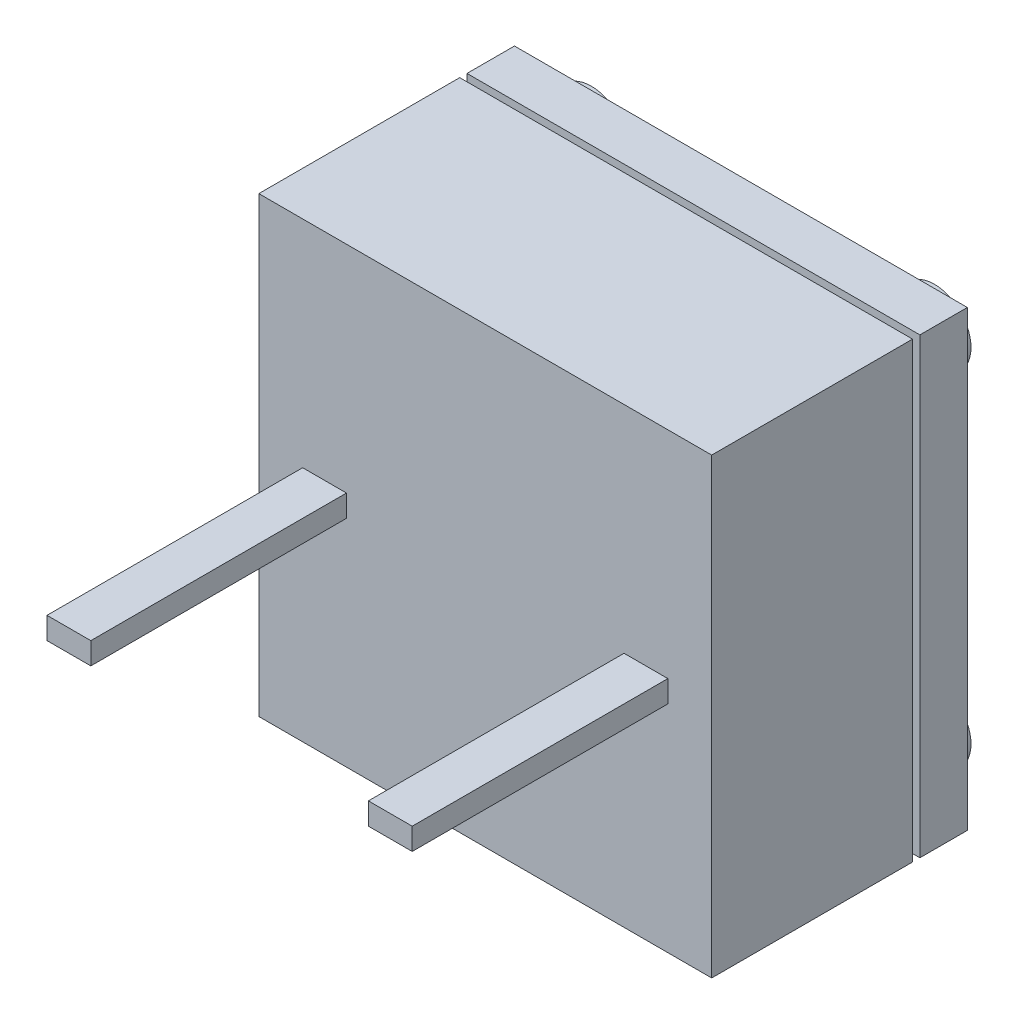
ISO-10303-21;
HEADER;
FILE_DESCRIPTION(('STEP AP214'),'2;1');
FILE_NAME('part.step','',(''),(''),'','','');
FILE_SCHEMA(('AUTOMOTIVE_DESIGN { 1 0 10303 214 1 1 1 1 }'));
ENDSEC;
DATA;
#1=APPLICATION_CONTEXT('core data for automotive mechanical design processes');
#2=APPLICATION_PROTOCOL_DEFINITION('international standard','automotive_design',2000,#1);
#3=PRODUCT_CONTEXT('',#1,'mechanical');
#4=PRODUCT('Part','Part','',(#3));
#5=PRODUCT_RELATED_PRODUCT_CATEGORY('part','',(#4));
#6=PRODUCT_DEFINITION_FORMATION('','',#4);
#7=PRODUCT_DEFINITION_CONTEXT('part definition',#1,'design');
#8=PRODUCT_DEFINITION('design','',#6,#7);
#9=PRODUCT_DEFINITION_SHAPE('','',#8);
#10=(LENGTH_UNIT() NAMED_UNIT(*) SI_UNIT(.MILLI.,.METRE.));
#11=(NAMED_UNIT(*) PLANE_ANGLE_UNIT() SI_UNIT($,.RADIAN.));
#12=(NAMED_UNIT(*) SI_UNIT($,.STERADIAN.) SOLID_ANGLE_UNIT());
#13=UNCERTAINTY_MEASURE_WITH_UNIT(LENGTH_MEASURE(1.E-05),#10,'distance_accuracy_value','');
#14=(GEOMETRIC_REPRESENTATION_CONTEXT(3) GLOBAL_UNCERTAINTY_ASSIGNED_CONTEXT((#13)) GLOBAL_UNIT_ASSIGNED_CONTEXT((#10,
#11,#12)) REPRESENTATION_CONTEXT('',''));
#15=CARTESIAN_POINT('',(0.,0.,0.));
#16=DIRECTION('',(0.,0.,1.));
#17=DIRECTION('',(1.,0.,0.));
#18=AXIS2_PLACEMENT_3D('',#15,#16,#17);
#19=CARTESIAN_POINT('',(0.,0.,3.5));
#20=DIRECTION('',(0.,0.,1.));
#21=DIRECTION('',(1.,0.,0.));
#22=AXIS2_PLACEMENT_3D('',#19,#20,#21);
#23=PLANE('',#22);
#24=DIRECTION('',(1.,0.,0.));
#25=VECTOR('',#24,1.);
#26=CARTESIAN_POINT('',(0.,0.,3.5));
#27=LINE('',#26,#25);
#28=CARTESIAN_POINT('',(0.,0.,3.5));
#29=VERTEX_POINT('',#28);
#30=CARTESIAN_POINT('',(6.2,0.,3.5));
#31=VERTEX_POINT('',#30);
#32=EDGE_CURVE('E290',#29,#31,#27,.T.);
#33=ORIENTED_EDGE('',*,*,#32,.T.);
#34=DIRECTION('',(0.,1.,0.));
#35=VECTOR('',#34,1.);
#36=CARTESIAN_POINT('',(6.2,0.,3.5));
#37=LINE('',#36,#35);
#38=CARTESIAN_POINT('',(6.2,6.2,3.5));
#39=VERTEX_POINT('',#38);
#40=EDGE_CURVE('E293',#31,#39,#37,.T.);
#41=ORIENTED_EDGE('',*,*,#40,.T.);
#42=DIRECTION('',(-1.,0.,0.));
#43=VECTOR('',#42,1.);
#44=CARTESIAN_POINT('',(0.,6.2,3.5));
#45=LINE('',#44,#43);
#46=CARTESIAN_POINT('',(0.,6.2,3.5));
#47=VERTEX_POINT('',#46);
#48=EDGE_CURVE('E296',#39,#47,#45,.T.);
#49=ORIENTED_EDGE('',*,*,#48,.T.);
#50=DIRECTION('',(0.,-1.,0.));
#51=VECTOR('',#50,1.);
#52=CARTESIAN_POINT('',(0.,0.,3.5));
#53=LINE('',#52,#51);
#54=EDGE_CURVE('E298',#47,#29,#53,.T.);
#55=ORIENTED_EDGE('',*,*,#54,.T.);
#56=EDGE_LOOP('',(#33,#41,#49,#55));
#57=FACE_BOUND('',#56,.T.);
#58=DIRECTION('',(-1.,0.,0.));
#59=VECTOR('',#58,1.);
#60=CARTESIAN_POINT('',(0.6,3.25,3.5));
#61=LINE('',#60,#59);
#62=CARTESIAN_POINT('',(1.2,3.25,3.5));
#63=VERTEX_POINT('',#62);
#64=CARTESIAN_POINT('',(0.6,3.25,3.5));
#65=VERTEX_POINT('',#64);
#66=EDGE_CURVE('E201',#63,#65,#61,.T.);
#67=ORIENTED_EDGE('',*,*,#66,.F.);
#68=DIRECTION('',(0.,1.,0.));
#69=VECTOR('',#68,1.);
#70=CARTESIAN_POINT('',(1.2,3.25,3.5));
#71=LINE('',#70,#69);
#72=CARTESIAN_POINT('',(1.2,2.95,3.5));
#73=VERTEX_POINT('',#72);
#74=EDGE_CURVE('E198',#73,#63,#71,.T.);
#75=ORIENTED_EDGE('',*,*,#74,.F.);
#76=DIRECTION('',(1.,0.,0.));
#77=VECTOR('',#76,1.);
#78=CARTESIAN_POINT('',(0.6,2.95,3.5));
#79=LINE('',#78,#77);
#80=CARTESIAN_POINT('',(0.6,2.95,3.5));
#81=VERTEX_POINT('',#80);
#82=EDGE_CURVE('E210',#81,#73,#79,.T.);
#83=ORIENTED_EDGE('',*,*,#82,.F.);
#84=DIRECTION('',(0.,-1.,0.));
#85=VECTOR('',#84,1.);
#86=CARTESIAN_POINT('',(0.6,2.95,3.5));
#87=LINE('',#86,#85);
#88=EDGE_CURVE('E218',#65,#81,#87,.T.);
#89=ORIENTED_EDGE('',*,*,#88,.F.);
#90=EDGE_LOOP('',(#67,#75,#83,#89));
#91=FACE_BOUND('',#90,.T.);
#92=DIRECTION('',(1.,0.,0.));
#93=VECTOR('',#92,1.);
#94=CARTESIAN_POINT('',(5.,2.95,3.5));
#95=LINE('',#94,#93);
#96=CARTESIAN_POINT('',(5.,2.95,3.5));
#97=VERTEX_POINT('',#96);
#98=CARTESIAN_POINT('',(5.6,2.95,3.5));
#99=VERTEX_POINT('',#98);
#100=EDGE_CURVE('E768',#97,#99,#95,.T.);
#101=ORIENTED_EDGE('',*,*,#100,.F.);
#102=DIRECTION('',(0.,-1.,0.));
#103=VECTOR('',#102,1.);
#104=CARTESIAN_POINT('',(5.,3.25,3.5));
#105=LINE('',#104,#103);
#106=CARTESIAN_POINT('',(5.,3.25,3.5));
#107=VERTEX_POINT('',#106);
#108=EDGE_CURVE('E196',#107,#97,#105,.T.);
#109=ORIENTED_EDGE('',*,*,#108,.F.);
#110=DIRECTION('',(-1.,0.,0.));
#111=VECTOR('',#110,1.);
#112=CARTESIAN_POINT('',(5.6,3.25,3.5));
#113=LINE('',#112,#111);
#114=CARTESIAN_POINT('',(5.6,3.25,3.5));
#115=VERTEX_POINT('',#114);
#116=EDGE_CURVE('E192',#115,#107,#113,.T.);
#117=ORIENTED_EDGE('',*,*,#116,.F.);
#118=DIRECTION('',(0.,1.,0.));
#119=VECTOR('',#118,1.);
#120=CARTESIAN_POINT('',(5.6,3.1,3.5));
#121=LINE('',#120,#119);
#122=EDGE_CURVE('E765',#99,#115,#121,.T.);
#123=ORIENTED_EDGE('',*,*,#122,.F.);
#124=EDGE_LOOP('',(#101,#109,#117,#123));
#125=FACE_BOUND('',#124,.T.);
#126=ADVANCED_FACE('F35',(#57,#91,#125),#23,.T.);
#127=CARTESIAN_POINT('',(0.,0.,3.5));
#128=DIRECTION('',(0.,1.,0.));
#129=DIRECTION('',(0.,0.,1.));
#130=AXIS2_PLACEMENT_3D('',#127,#128,#129);
#131=PLANE('',#130);
#132=DIRECTION('',(-1.,0.,0.));
#133=VECTOR('',#132,1.);
#134=CARTESIAN_POINT('',(6.2,0.,0.650000000000001));
#135=LINE('',#134,#133);
#136=CARTESIAN_POINT('',(6.2,0.,0.650000000000001));
#137=VERTEX_POINT('',#136);
#138=CARTESIAN_POINT('',(0.,0.,0.650000000000001));
#139=VERTEX_POINT('',#138);
#140=EDGE_CURVE('E260',#137,#139,#135,.T.);
#141=ORIENTED_EDGE('',*,*,#140,.T.);
#142=DIRECTION('',(0.,0.,-1.));
#143=VECTOR('',#142,1.);
#144=CARTESIAN_POINT('',(0.,0.,3.5));
#145=LINE('',#144,#143);
#146=CARTESIAN_POINT('',(0.,0.,0.));
#147=VERTEX_POINT('',#146);
#148=EDGE_CURVE('E300',#139,#147,#145,.T.);
#149=ORIENTED_EDGE('',*,*,#148,.T.);
#150=DIRECTION('',(1.,0.,0.));
#151=VECTOR('',#150,1.);
#152=CARTESIAN_POINT('',(0.,0.,0.));
#153=LINE('',#152,#151);
#154=CARTESIAN_POINT('',(6.2,0.,0.));
#155=VERTEX_POINT('',#154);
#156=EDGE_CURVE('E284',#147,#155,#153,.T.);
#157=ORIENTED_EDGE('',*,*,#156,.T.);
#158=DIRECTION('',(0.,0.,-1.));
#159=VECTOR('',#158,1.);
#160=CARTESIAN_POINT('',(6.2,0.,3.5));
#161=LINE('',#160,#159);
#162=EDGE_CURVE('E322',#137,#155,#161,.T.);
#163=ORIENTED_EDGE('',*,*,#162,.F.);
#164=EDGE_LOOP('',(#141,#149,#157,#163));
#165=FACE_BOUND('',#164,.T.);
#166=ADVANCED_FACE('F362',(#165),#131,.F.);
#167=CARTESIAN_POINT('',(0.,0.,0.750000000000001));
#168=VERTEX_POINT('',#167);
#169=EDGE_CURVE('E311',#29,#168,#145,.T.);
#170=ORIENTED_EDGE('',*,*,#169,.T.);
#171=DIRECTION('',(1.,0.,0.));
#172=VECTOR('',#171,1.);
#173=CARTESIAN_POINT('',(6.1,0.,0.750000000000001));
#174=LINE('',#173,#172);
#175=CARTESIAN_POINT('',(6.2,0.,0.750000000000001));
#176=VERTEX_POINT('',#175);
#177=EDGE_CURVE('E257',#168,#176,#174,.T.);
#178=ORIENTED_EDGE('',*,*,#177,.T.);
#179=EDGE_CURVE('E323',#31,#176,#161,.T.);
#180=ORIENTED_EDGE('',*,*,#179,.F.);
#181=ORIENTED_EDGE('',*,*,#32,.F.);
#182=EDGE_LOOP('',(#170,#178,#180,#181));
#183=FACE_BOUND('',#182,.T.);
#184=ADVANCED_FACE('F37',(#183),#131,.F.);
#185=CARTESIAN_POINT('',(6.2,0.,3.5));
#186=DIRECTION('',(-1.,0.,0.));
#187=DIRECTION('',(0.,0.,1.));
#188=AXIS2_PLACEMENT_3D('',#185,#186,#187);
#189=PLANE('',#188);
#190=ORIENTED_EDGE('',*,*,#179,.T.);
#191=DIRECTION('',(0.,1.,0.));
#192=VECTOR('',#191,1.);
#193=CARTESIAN_POINT('',(6.2,6.1,0.750000000000001));
#194=LINE('',#193,#192);
#195=CARTESIAN_POINT('',(6.2,6.2,0.750000000000001));
#196=VERTEX_POINT('',#195);
#197=EDGE_CURVE('E287',#176,#196,#194,.T.);
#198=ORIENTED_EDGE('',*,*,#197,.T.);
#199=DIRECTION('',(0.,0.,-1.));
#200=VECTOR('',#199,1.);
#201=CARTESIAN_POINT('',(6.2,6.2,3.5));
#202=LINE('',#201,#200);
#203=EDGE_CURVE('E319',#39,#196,#202,.T.);
#204=ORIENTED_EDGE('',*,*,#203,.F.);
#205=ORIENTED_EDGE('',*,*,#40,.F.);
#206=EDGE_LOOP('',(#190,#198,#204,#205));
#207=FACE_BOUND('',#206,.T.);
#208=ADVANCED_FACE('F402',(#207),#189,.F.);
#209=CARTESIAN_POINT('',(0.,0.,3.5));
#210=DIRECTION('',(1.,0.,0.));
#211=DIRECTION('',(0.,0.,-1.));
#212=AXIS2_PLACEMENT_3D('',#209,#210,#211);
#213=PLANE('',#212);
#214=ORIENTED_EDGE('',*,*,#148,.F.);
#215=DIRECTION('',(0.,1.,0.));
#216=VECTOR('',#215,1.);
#217=CARTESIAN_POINT('',(0.,6.1,0.650000000000001));
#218=LINE('',#217,#216);
#219=CARTESIAN_POINT('',(0.,6.2,0.650000000000001));
#220=VERTEX_POINT('',#219);
#221=EDGE_CURVE('E282',#139,#220,#218,.T.);
#222=ORIENTED_EDGE('',*,*,#221,.T.);
#223=DIRECTION('',(0.,0.,-1.));
#224=VECTOR('',#223,1.);
#225=CARTESIAN_POINT('',(0.,6.2,3.5));
#226=LINE('',#225,#224);
#227=CARTESIAN_POINT('',(0.,6.2,0.));
#228=VERTEX_POINT('',#227);
#229=EDGE_CURVE('E314',#220,#228,#226,.T.);
#230=ORIENTED_EDGE('',*,*,#229,.T.);
#231=DIRECTION('',(0.,-1.,0.));
#232=VECTOR('',#231,1.);
#233=CARTESIAN_POINT('',(0.,0.,0.));
#234=LINE('',#233,#232);
#235=EDGE_CURVE('E294',#228,#147,#234,.T.);
#236=ORIENTED_EDGE('',*,*,#235,.T.);
#237=EDGE_LOOP('',(#214,#222,#230,#236));
#238=FACE_BOUND('',#237,.T.);
#239=ADVANCED_FACE('F367',(#238),#213,.F.);
#240=CARTESIAN_POINT('',(0.,6.1,0.));
#241=DIRECTION('',(0.,1.,0.));
#242=DIRECTION('',(0.,0.,1.));
#243=AXIS2_PLACEMENT_3D('',#240,#241,#242);
#244=PLANE('',#243);
#245=DIRECTION('',(0.,0.,1.));
#246=VECTOR('',#245,1.);
#247=CARTESIAN_POINT('',(6.1,6.1,0.));
#248=LINE('',#247,#246);
#249=CARTESIAN_POINT('',(6.1,6.1,0.650000000000001));
#250=VERTEX_POINT('',#249);
#251=CARTESIAN_POINT('',(6.1,6.1,0.750000000000001));
#252=VERTEX_POINT('',#251);
#253=EDGE_CURVE('E329',#250,#252,#248,.T.);
#254=ORIENTED_EDGE('',*,*,#253,.F.);
#255=DIRECTION('',(-1.,0.,0.));
#256=VECTOR('',#255,1.);
#257=CARTESIAN_POINT('',(0.,6.1,0.650000000000001));
#258=LINE('',#257,#256);
#259=CARTESIAN_POINT('',(0.1,6.1,0.650000000000001));
#260=VERTEX_POINT('',#259);
#261=EDGE_CURVE('E273',#250,#260,#258,.T.);
#262=ORIENTED_EDGE('',*,*,#261,.T.);
#263=DIRECTION('',(0.,0.,1.));
#264=VECTOR('',#263,1.);
#265=CARTESIAN_POINT('',(0.100000000000001,6.1,0.));
#266=LINE('',#265,#264);
#267=CARTESIAN_POINT('',(0.1,6.1,0.750000000000001));
#268=VERTEX_POINT('',#267);
#269=EDGE_CURVE('E326',#260,#268,#266,.T.);
#270=ORIENTED_EDGE('',*,*,#269,.T.);
#271=DIRECTION('',(1.,0.,0.));
#272=VECTOR('',#271,1.);
#273=CARTESIAN_POINT('',(0.,6.1,0.750000000000001));
#274=LINE('',#273,#272);
#275=EDGE_CURVE('E270',#268,#252,#274,.T.);
#276=ORIENTED_EDGE('',*,*,#275,.T.);
#277=EDGE_LOOP('',(#254,#262,#270,#276));
#278=FACE_BOUND('',#277,.T.);
#279=ADVANCED_FACE('F406',(#278),#244,.T.);
#280=CARTESIAN_POINT('',(0.,6.2,3.5));
#281=DIRECTION('',(0.,-1.,0.));
#282=DIRECTION('',(0.,0.,-1.));
#283=AXIS2_PLACEMENT_3D('',#280,#281,#282);
#284=PLANE('',#283);
#285=ORIENTED_EDGE('',*,*,#229,.F.);
#286=DIRECTION('',(-1.,0.,0.));
#287=VECTOR('',#286,1.);
#288=CARTESIAN_POINT('',(0.,6.2,0.650000000000001));
#289=LINE('',#288,#287);
#290=CARTESIAN_POINT('',(6.2,6.2,0.650000000000001));
#291=VERTEX_POINT('',#290);
#292=EDGE_CURVE('E274',#291,#220,#289,.T.);
#293=ORIENTED_EDGE('',*,*,#292,.F.);
#294=CARTESIAN_POINT('',(6.2,6.2,0.));
#295=VERTEX_POINT('',#294);
#296=EDGE_CURVE('E318',#291,#295,#202,.T.);
#297=ORIENTED_EDGE('',*,*,#296,.T.);
#298=DIRECTION('',(-1.,0.,0.));
#299=VECTOR('',#298,1.);
#300=CARTESIAN_POINT('',(0.,6.2,0.));
#301=LINE('',#300,#299);
#302=EDGE_CURVE('E306',#295,#228,#301,.T.);
#303=ORIENTED_EDGE('',*,*,#302,.T.);
#304=EDGE_LOOP('',(#285,#293,#297,#303));
#305=FACE_BOUND('',#304,.T.);
#306=ADVANCED_FACE('F371',(#305),#284,.F.);
#307=DIRECTION('',(0.,1.,0.));
#308=VECTOR('',#307,1.);
#309=CARTESIAN_POINT('',(6.2,6.1,0.650000000000001));
#310=LINE('',#309,#308);
#311=EDGE_CURVE('E285',#137,#291,#310,.T.);
#312=ORIENTED_EDGE('',*,*,#311,.F.);
#313=ORIENTED_EDGE('',*,*,#162,.T.);
#314=DIRECTION('',(0.,1.,0.));
#315=VECTOR('',#314,1.);
#316=CARTESIAN_POINT('',(6.2,0.,0.));
#317=LINE('',#316,#315);
#318=EDGE_CURVE('E303',#155,#295,#317,.T.);
#319=ORIENTED_EDGE('',*,*,#318,.T.);
#320=ORIENTED_EDGE('',*,*,#296,.F.);
#321=EDGE_LOOP('',(#312,#313,#319,#320));
#322=FACE_BOUND('',#321,.T.);
#323=ADVANCED_FACE('F374',(#322),#189,.F.);
#324=ORIENTED_EDGE('',*,*,#203,.T.);
#325=DIRECTION('',(1.,0.,0.));
#326=VECTOR('',#325,1.);
#327=CARTESIAN_POINT('',(0.,6.2,0.750000000000001));
#328=LINE('',#327,#326);
#329=CARTESIAN_POINT('',(0.,6.2,0.750000000000001));
#330=VERTEX_POINT('',#329);
#331=EDGE_CURVE('E266',#330,#196,#328,.T.);
#332=ORIENTED_EDGE('',*,*,#331,.F.);
#333=EDGE_CURVE('E315',#47,#330,#226,.T.);
#334=ORIENTED_EDGE('',*,*,#333,.F.);
#335=ORIENTED_EDGE('',*,*,#48,.F.);
#336=EDGE_LOOP('',(#324,#332,#334,#335));
#337=FACE_BOUND('',#336,.T.);
#338=ADVANCED_FACE('F397',(#337),#284,.F.);
#339=DIRECTION('',(0.,1.,0.));
#340=VECTOR('',#339,1.);
#341=CARTESIAN_POINT('',(0.,6.1,0.750000000000001));
#342=LINE('',#341,#340);
#343=EDGE_CURVE('E277',#168,#330,#342,.T.);
#344=ORIENTED_EDGE('',*,*,#343,.F.);
#345=ORIENTED_EDGE('',*,*,#169,.F.);
#346=ORIENTED_EDGE('',*,*,#54,.F.);
#347=ORIENTED_EDGE('',*,*,#333,.T.);
#348=EDGE_LOOP('',(#344,#345,#346,#347));
#349=FACE_BOUND('',#348,.T.);
#350=ADVANCED_FACE('F347',(#349),#213,.F.);
#351=CARTESIAN_POINT('',(0.,0.,0.));
#352=DIRECTION('',(0.,0.,1.));
#353=DIRECTION('',(1.,0.,0.));
#354=AXIS2_PLACEMENT_3D('',#351,#352,#353);
#355=PLANE('',#354);
#356=CARTESIAN_POINT('',(5.45,5.45,0.));
#357=DIRECTION('',(0.,0.,1.));
#358=DIRECTION('',(1.,0.,0.));
#359=AXIS2_PLACEMENT_3D('',#356,#357,#358);
#360=CIRCLE('',#359,0.5);
#361=CARTESIAN_POINT('',(5.95,5.45,0.));
#362=VERTEX_POINT('',#361);
#363=EDGE_CURVE('E11',#362,#362,#360,.F.);
#364=ORIENTED_EDGE('',*,*,#363,.F.);
#365=EDGE_LOOP('',(#364));
#366=FACE_BOUND('',#365,.T.);
#367=CARTESIAN_POINT('',(0.75,5.45,0.));
#368=DIRECTION('',(0.,0.,1.));
#369=DIRECTION('',(1.,0.,0.));
#370=AXIS2_PLACEMENT_3D('',#367,#368,#369);
#371=CIRCLE('',#370,0.5);
#372=CARTESIAN_POINT('',(1.25,5.45,0.));
#373=VERTEX_POINT('',#372);
#374=EDGE_CURVE('E43',#373,#373,#371,.F.);
#375=ORIENTED_EDGE('',*,*,#374,.F.);
#376=EDGE_LOOP('',(#375));
#377=FACE_BOUND('',#376,.T.);
#378=CARTESIAN_POINT('',(5.45,0.749999999999999,0.));
#379=DIRECTION('',(0.,0.,1.));
#380=DIRECTION('',(1.,0.,0.));
#381=AXIS2_PLACEMENT_3D('',#378,#379,#380);
#382=CIRCLE('',#381,0.5);
#383=CARTESIAN_POINT('',(5.95,0.749999999999999,0.));
#384=VERTEX_POINT('',#383);
#385=EDGE_CURVE('E336',#384,#384,#382,.F.);
#386=ORIENTED_EDGE('',*,*,#385,.F.);
#387=EDGE_LOOP('',(#386));
#388=FACE_BOUND('',#387,.T.);
#389=CARTESIAN_POINT('',(0.75,0.749999999999999,0.));
#390=DIRECTION('',(0.,0.,1.));
#391=DIRECTION('',(1.,0.,0.));
#392=AXIS2_PLACEMENT_3D('',#389,#390,#391);
#393=CIRCLE('',#392,0.5);
#394=CARTESIAN_POINT('',(1.25,0.749999999999999,0.));
#395=VERTEX_POINT('',#394);
#396=EDGE_CURVE('E248',#395,#395,#393,.F.);
#397=ORIENTED_EDGE('',*,*,#396,.F.);
#398=EDGE_LOOP('',(#397));
#399=FACE_BOUND('',#398,.T.);
#400=CARTESIAN_POINT('',(3.1,3.1,0.));
#401=DIRECTION('',(0.,0.,-1.));
#402=DIRECTION('',(-1.,0.,0.));
#403=AXIS2_PLACEMENT_3D('',#400,#401,#402);
#404=CIRCLE('',#403,1.75);
#405=CARTESIAN_POINT('',(1.35,3.1,0.));
#406=VERTEX_POINT('',#405);
#407=EDGE_CURVE('E245',#406,#406,#404,.T.);
#408=ORIENTED_EDGE('',*,*,#407,.F.);
#409=EDGE_LOOP('',(#408));
#410=FACE_BOUND('',#409,.T.);
#411=ORIENTED_EDGE('',*,*,#156,.F.);
#412=ORIENTED_EDGE('',*,*,#235,.F.);
#413=ORIENTED_EDGE('',*,*,#302,.F.);
#414=ORIENTED_EDGE('',*,*,#318,.F.);
#415=EDGE_LOOP('',(#411,#412,#413,#414));
#416=FACE_BOUND('',#415,.T.);
#417=ADVANCED_FACE('F343',(#366,#377,#388,#399,#410,#416),#355,.F.);
#418=CARTESIAN_POINT('',(0.,6.1,0.650000000000001));
#419=DIRECTION('',(0.,0.,-1.));
#420=DIRECTION('',(-1.,0.,0.));
#421=AXIS2_PLACEMENT_3D('',#418,#419,#420);
#422=PLANE('',#421);
#423=DIRECTION('',(-1.,0.,0.));
#424=VECTOR('',#423,1.);
#425=CARTESIAN_POINT('',(6.2,0.1,0.650000000000008));
#426=LINE('',#425,#424);
#427=CARTESIAN_POINT('',(6.1,0.1,0.650000000000008));
#428=VERTEX_POINT('',#427);
#429=CARTESIAN_POINT('',(0.100000000000002,0.1,0.650000000000001));
#430=VERTEX_POINT('',#429);
#431=EDGE_CURVE('E250',#428,#430,#426,.T.);
#432=ORIENTED_EDGE('',*,*,#431,.T.);
#433=DIRECTION('',(0.,1.,0.));
#434=VECTOR('',#433,1.);
#435=CARTESIAN_POINT('',(0.1,0.,0.650000000000001));
#436=LINE('',#435,#434);
#437=EDGE_CURVE('E256',#430,#260,#436,.T.);
#438=ORIENTED_EDGE('',*,*,#437,.T.);
#439=ORIENTED_EDGE('',*,*,#261,.F.);
#440=DIRECTION('',(0.,1.,0.));
#441=VECTOR('',#440,1.);
#442=CARTESIAN_POINT('',(6.1,0.,0.650000000000001));
#443=LINE('',#442,#441);
#444=EDGE_CURVE('E263',#428,#250,#443,.T.);
#445=ORIENTED_EDGE('',*,*,#444,.F.);
#446=EDGE_LOOP('',(#432,#438,#439,#445));
#447=FACE_BOUND('',#446,.T.);
#448=ORIENTED_EDGE('',*,*,#292,.T.);
#449=ORIENTED_EDGE('',*,*,#221,.F.);
#450=ORIENTED_EDGE('',*,*,#140,.F.);
#451=ORIENTED_EDGE('',*,*,#311,.T.);
#452=EDGE_LOOP('',(#448,#449,#450,#451));
#453=FACE_BOUND('',#452,.T.);
#454=ADVANCED_FACE('F346',(#447,#453),#422,.F.);
#455=CARTESIAN_POINT('',(0.,6.1,0.750000000000001));
#456=DIRECTION('',(0.,0.,1.));
#457=DIRECTION('',(1.,0.,0.));
#458=AXIS2_PLACEMENT_3D('',#455,#456,#457);
#459=PLANE('',#458);
#460=DIRECTION('',(-1.,0.,0.));
#461=VECTOR('',#460,1.);
#462=CARTESIAN_POINT('',(6.2,0.1,0.750000000000008));
#463=LINE('',#462,#461);
#464=CARTESIAN_POINT('',(6.1,0.1,0.750000000000001));
#465=VERTEX_POINT('',#464);
#466=CARTESIAN_POINT('',(0.100000000000002,0.1,0.750000000000001));
#467=VERTEX_POINT('',#466);
#468=EDGE_CURVE('E244',#465,#467,#463,.T.);
#469=ORIENTED_EDGE('',*,*,#468,.F.);
#470=DIRECTION('',(0.,1.,0.));
#471=VECTOR('',#470,1.);
#472=CARTESIAN_POINT('',(6.1,0.,0.750000000000001));
#473=LINE('',#472,#471);
#474=EDGE_CURVE('E264',#465,#252,#473,.T.);
#475=ORIENTED_EDGE('',*,*,#474,.T.);
#476=ORIENTED_EDGE('',*,*,#275,.F.);
#477=DIRECTION('',(0.,1.,0.));
#478=VECTOR('',#477,1.);
#479=CARTESIAN_POINT('',(0.1,0.,0.750000000000001));
#480=LINE('',#479,#478);
#481=EDGE_CURVE('E261',#467,#268,#480,.T.);
#482=ORIENTED_EDGE('',*,*,#481,.F.);
#483=EDGE_LOOP('',(#469,#475,#476,#482));
#484=FACE_BOUND('',#483,.T.);
#485=ORIENTED_EDGE('',*,*,#331,.T.);
#486=ORIENTED_EDGE('',*,*,#197,.F.);
#487=ORIENTED_EDGE('',*,*,#177,.F.);
#488=ORIENTED_EDGE('',*,*,#343,.T.);
#489=EDGE_LOOP('',(#485,#486,#487,#488));
#490=FACE_BOUND('',#489,.T.);
#491=ADVANCED_FACE('F377',(#484,#490),#459,.F.);
#492=CARTESIAN_POINT('',(0.1,0.,0.650000000000001));
#493=DIRECTION('',(-1.,0.,0.));
#494=DIRECTION('',(0.,0.,1.));
#495=AXIS2_PLACEMENT_3D('',#492,#493,#494);
#496=PLANE('',#495);
#497=DIRECTION('',(0.,0.,-1.));
#498=VECTOR('',#497,1.);
#499=CARTESIAN_POINT('',(0.1,0.1,0.650000000000001));
#500=LINE('',#499,#498);
#501=EDGE_CURVE('E253',#467,#430,#500,.T.);
#502=ORIENTED_EDGE('',*,*,#501,.F.);
#503=ORIENTED_EDGE('',*,*,#481,.T.);
#504=ORIENTED_EDGE('',*,*,#269,.F.);
#505=ORIENTED_EDGE('',*,*,#437,.F.);
#506=EDGE_LOOP('',(#502,#503,#504,#505));
#507=FACE_BOUND('',#506,.T.);
#508=ADVANCED_FACE('F383',(#507),#496,.T.);
#509=CARTESIAN_POINT('',(6.1,0.,0.650000000000001));
#510=DIRECTION('',(-1.,0.,0.));
#511=DIRECTION('',(0.,0.,1.));
#512=AXIS2_PLACEMENT_3D('',#509,#510,#511);
#513=PLANE('',#512);
#514=ORIENTED_EDGE('',*,*,#474,.F.);
#515=DIRECTION('',(0.,0.,-1.));
#516=VECTOR('',#515,1.);
#517=CARTESIAN_POINT('',(6.1,0.1,0.650000000000001));
#518=LINE('',#517,#516);
#519=EDGE_CURVE('E249',#465,#428,#518,.T.);
#520=ORIENTED_EDGE('',*,*,#519,.T.);
#521=ORIENTED_EDGE('',*,*,#444,.T.);
#522=ORIENTED_EDGE('',*,*,#253,.T.);
#523=EDGE_LOOP('',(#514,#520,#521,#522));
#524=FACE_BOUND('',#523,.T.);
#525=ADVANCED_FACE('F489',(#524),#513,.F.);
#526=CARTESIAN_POINT('',(6.2,0.1,0.650000000000008));
#527=DIRECTION('',(0.,1.,0.));
#528=DIRECTION('',(0.,0.,1.));
#529=AXIS2_PLACEMENT_3D('',#526,#527,#528);
#530=PLANE('',#529);
#531=ORIENTED_EDGE('',*,*,#501,.T.);
#532=ORIENTED_EDGE('',*,*,#431,.F.);
#533=ORIENTED_EDGE('',*,*,#519,.F.);
#534=ORIENTED_EDGE('',*,*,#468,.T.);
#535=EDGE_LOOP('',(#531,#532,#533,#534));
#536=FACE_BOUND('',#535,.T.);
#537=ADVANCED_FACE('F498',(#536),#530,.F.);
#538=CARTESIAN_POINT('',(3.1,3.1,-1.));
#539=DIRECTION('',(0.,0.,1.));
#540=DIRECTION('',(1.,0.,0.));
#541=AXIS2_PLACEMENT_3D('',#538,#539,#540);
#542=CYLINDRICAL_SURFACE('',#541,1.75);
#543=CARTESIAN_POINT('',(3.1,3.1,-1.));
#544=DIRECTION('',(0.,0.,-1.));
#545=DIRECTION('',(-1.,0.,0.));
#546=AXIS2_PLACEMENT_3D('',#543,#544,#545);
#547=CIRCLE('',#546,1.75);
#548=CARTESIAN_POINT('',(1.35,3.1,-1.));
#549=VERTEX_POINT('',#548);
#550=EDGE_CURVE('E241',#549,#549,#547,.T.);
#551=ORIENTED_EDGE('',*,*,#550,.F.);
#552=EDGE_LOOP('',(#551));
#553=FACE_BOUND('',#552,.T.);
#554=ORIENTED_EDGE('',*,*,#407,.T.);
#555=EDGE_LOOP('',(#554));
#556=FACE_BOUND('',#555,.T.);
#557=ADVANCED_FACE('F507',(#553,#556),#542,.T.);
#558=CARTESIAN_POINT('',(3.1,3.1,-1.));
#559=DIRECTION('',(0.,0.,-1.));
#560=DIRECTION('',(-1.,0.,0.));
#561=AXIS2_PLACEMENT_3D('',#558,#559,#560);
#562=PLANE('',#561);
#563=ORIENTED_EDGE('',*,*,#550,.T.);
#564=EDGE_LOOP('',(#563));
#565=FACE_BOUND('',#564,.T.);
#566=ADVANCED_FACE('F518',(#565),#562,.T.);
#567=CARTESIAN_POINT('',(0.75,0.749999999999999,-0.3));
#568=DIRECTION('',(0.,0.,1.));
#569=DIRECTION('',(1.,0.,0.));
#570=AXIS2_PLACEMENT_3D('',#567,#568,#569);
#571=CYLINDRICAL_SURFACE('',#570,0.5);
#572=CARTESIAN_POINT('',(0.75,0.749999999999999,-0.3));
#573=DIRECTION('',(0.,0.,-1.));
#574=DIRECTION('',(-1.,0.,0.));
#575=AXIS2_PLACEMENT_3D('',#572,#573,#574);
#576=CIRCLE('',#575,0.5);
#577=CARTESIAN_POINT('',(0.25,0.749999999999999,-0.3));
#578=VERTEX_POINT('',#577);
#579=EDGE_CURVE('E238',#578,#578,#576,.T.);
#580=ORIENTED_EDGE('',*,*,#579,.F.);
#581=EDGE_LOOP('',(#580));
#582=FACE_BOUND('',#581,.T.);
#583=ORIENTED_EDGE('',*,*,#396,.T.);
#584=EDGE_LOOP('',(#583));
#585=FACE_BOUND('',#584,.T.);
#586=ADVANCED_FACE('F530',(#582,#585),#571,.T.);
#587=CARTESIAN_POINT('',(0.75,0.749999999999999,-0.3));
#588=DIRECTION('',(0.,0.,-1.));
#589=DIRECTION('',(-1.,0.,0.));
#590=AXIS2_PLACEMENT_3D('',#587,#588,#589);
#591=PLANE('',#590);
#592=ORIENTED_EDGE('',*,*,#579,.T.);
#593=EDGE_LOOP('',(#592));
#594=FACE_BOUND('',#593,.T.);
#595=ADVANCED_FACE('F548',(#594),#591,.T.);
#596=CARTESIAN_POINT('',(5.45,0.749999999999999,-0.3));
#597=DIRECTION('',(0.,0.,1.));
#598=DIRECTION('',(1.,0.,0.));
#599=AXIS2_PLACEMENT_3D('',#596,#597,#598);
#600=CYLINDRICAL_SURFACE('',#599,0.5);
#601=CARTESIAN_POINT('',(5.45,0.749999999999999,-0.3));
#602=DIRECTION('',(0.,0.,-1.));
#603=DIRECTION('',(-1.,0.,0.));
#604=AXIS2_PLACEMENT_3D('',#601,#602,#603);
#605=CIRCLE('',#604,0.5);
#606=CARTESIAN_POINT('',(4.95,0.749999999999999,-0.3));
#607=VERTEX_POINT('',#606);
#608=EDGE_CURVE('E235',#607,#607,#605,.T.);
#609=ORIENTED_EDGE('',*,*,#608,.F.);
#610=EDGE_LOOP('',(#609));
#611=FACE_BOUND('',#610,.T.);
#612=ORIENTED_EDGE('',*,*,#385,.T.);
#613=EDGE_LOOP('',(#612));
#614=FACE_BOUND('',#613,.T.);
#615=ADVANCED_FACE('F558',(#611,#614),#600,.T.);
#616=CARTESIAN_POINT('',(5.45,0.749999999999999,-0.3));
#617=DIRECTION('',(0.,0.,-1.));
#618=DIRECTION('',(-1.,0.,0.));
#619=AXIS2_PLACEMENT_3D('',#616,#617,#618);
#620=PLANE('',#619);
#621=ORIENTED_EDGE('',*,*,#608,.T.);
#622=EDGE_LOOP('',(#621));
#623=FACE_BOUND('',#622,.T.);
#624=ADVANCED_FACE('F569',(#623),#620,.T.);
#625=CARTESIAN_POINT('',(0.75,5.45,-0.3));
#626=DIRECTION('',(0.,0.,1.));
#627=DIRECTION('',(1.,0.,0.));
#628=AXIS2_PLACEMENT_3D('',#625,#626,#627);
#629=CYLINDRICAL_SURFACE('',#628,0.5);
#630=CARTESIAN_POINT('',(0.75,5.45,-0.3));
#631=DIRECTION('',(0.,0.,-1.));
#632=DIRECTION('',(-1.,0.,0.));
#633=AXIS2_PLACEMENT_3D('',#630,#631,#632);
#634=CIRCLE('',#633,0.5);
#635=CARTESIAN_POINT('',(0.25,5.45,-0.3));
#636=VERTEX_POINT('',#635);
#637=EDGE_CURVE('E232',#636,#636,#634,.T.);
#638=ORIENTED_EDGE('',*,*,#637,.F.);
#639=EDGE_LOOP('',(#638));
#640=FACE_BOUND('',#639,.T.);
#641=ORIENTED_EDGE('',*,*,#374,.T.);
#642=EDGE_LOOP('',(#641));
#643=FACE_BOUND('',#642,.T.);
#644=ADVANCED_FACE('F341',(#640,#643),#629,.T.);
#645=CARTESIAN_POINT('',(0.75,5.45,-0.3));
#646=DIRECTION('',(0.,0.,-1.));
#647=DIRECTION('',(-1.,0.,0.));
#648=AXIS2_PLACEMENT_3D('',#645,#646,#647);
#649=PLANE('',#648);
#650=ORIENTED_EDGE('',*,*,#637,.T.);
#651=EDGE_LOOP('',(#650));
#652=FACE_BOUND('',#651,.T.);
#653=ADVANCED_FACE('F590',(#652),#649,.T.);
#654=CARTESIAN_POINT('',(5.45,5.45,-0.3));
#655=DIRECTION('',(0.,0.,1.));
#656=DIRECTION('',(1.,0.,0.));
#657=AXIS2_PLACEMENT_3D('',#654,#655,#656);
#658=CYLINDRICAL_SURFACE('',#657,0.5);
#659=CARTESIAN_POINT('',(5.45,5.45,-0.3));
#660=DIRECTION('',(0.,0.,-1.));
#661=DIRECTION('',(-1.,0.,0.));
#662=AXIS2_PLACEMENT_3D('',#659,#660,#661);
#663=CIRCLE('',#662,0.5);
#664=CARTESIAN_POINT('',(4.95,5.45,-0.3));
#665=VERTEX_POINT('',#664);
#666=EDGE_CURVE('E229',#665,#665,#663,.T.);
#667=ORIENTED_EDGE('',*,*,#666,.F.);
#668=EDGE_LOOP('',(#667));
#669=FACE_BOUND('',#668,.T.);
#670=ORIENTED_EDGE('',*,*,#363,.T.);
#671=EDGE_LOOP('',(#670));
#672=FACE_BOUND('',#671,.T.);
#673=ADVANCED_FACE('F601',(#669,#672),#658,.T.);
#674=CARTESIAN_POINT('',(5.45,5.45,-0.3));
#675=DIRECTION('',(0.,0.,-1.));
#676=DIRECTION('',(-1.,0.,0.));
#677=AXIS2_PLACEMENT_3D('',#674,#675,#676);
#678=PLANE('',#677);
#679=ORIENTED_EDGE('',*,*,#666,.T.);
#680=EDGE_LOOP('',(#679));
#681=FACE_BOUND('',#680,.T.);
#682=ADVANCED_FACE('F612',(#681),#678,.T.);
#683=CARTESIAN_POINT('',(1.2,3.25,7.));
#684=DIRECTION('',(-1.,0.,0.));
#685=DIRECTION('',(0.,0.,1.));
#686=AXIS2_PLACEMENT_3D('',#683,#684,#685);
#687=PLANE('',#686);
#688=ORIENTED_EDGE('',*,*,#74,.T.);
#689=DIRECTION('',(0.,0.,-1.));
#690=VECTOR('',#689,1.);
#691=CARTESIAN_POINT('',(1.2,3.25,7.));
#692=LINE('',#691,#690);
#693=CARTESIAN_POINT('',(1.2,3.25,7.));
#694=VERTEX_POINT('',#693);
#695=EDGE_CURVE('E227',#694,#63,#692,.T.);
#696=ORIENTED_EDGE('',*,*,#695,.F.);
#697=DIRECTION('',(0.,1.,0.));
#698=VECTOR('',#697,1.);
#699=CARTESIAN_POINT('',(1.2,3.25,7.));
#700=LINE('',#699,#698);
#701=CARTESIAN_POINT('',(1.2,2.95,7.));
#702=VERTEX_POINT('',#701);
#703=EDGE_CURVE('E206',#702,#694,#700,.T.);
#704=ORIENTED_EDGE('',*,*,#703,.F.);
#705=DIRECTION('',(0.,0.,-1.));
#706=VECTOR('',#705,1.);
#707=CARTESIAN_POINT('',(1.2,2.95,7.));
#708=LINE('',#707,#706);
#709=EDGE_CURVE('E215',#702,#73,#708,.T.);
#710=ORIENTED_EDGE('',*,*,#709,.T.);
#711=EDGE_LOOP('',(#688,#696,#704,#710));
#712=FACE_BOUND('',#711,.T.);
#713=ADVANCED_FACE('F622',(#712),#687,.F.);
#714=CARTESIAN_POINT('',(0.6,3.25,7.));
#715=DIRECTION('',(0.,-1.,0.));
#716=DIRECTION('',(0.,0.,-1.));
#717=AXIS2_PLACEMENT_3D('',#714,#715,#716);
#718=PLANE('',#717);
#719=ORIENTED_EDGE('',*,*,#66,.T.);
#720=DIRECTION('',(0.,0.,-1.));
#721=VECTOR('',#720,1.);
#722=CARTESIAN_POINT('',(0.6,3.25,7.));
#723=LINE('',#722,#721);
#724=CARTESIAN_POINT('',(0.6,3.25,7.));
#725=VERTEX_POINT('',#724);
#726=EDGE_CURVE('E224',#725,#65,#723,.T.);
#727=ORIENTED_EDGE('',*,*,#726,.F.);
#728=DIRECTION('',(-1.,0.,0.));
#729=VECTOR('',#728,1.);
#730=CARTESIAN_POINT('',(0.6,3.25,7.));
#731=LINE('',#730,#729);
#732=EDGE_CURVE('E209',#694,#725,#731,.T.);
#733=ORIENTED_EDGE('',*,*,#732,.F.);
#734=ORIENTED_EDGE('',*,*,#695,.T.);
#735=EDGE_LOOP('',(#719,#727,#733,#734));
#736=FACE_BOUND('',#735,.T.);
#737=ADVANCED_FACE('F638',(#736),#718,.F.);
#738=CARTESIAN_POINT('',(0.6,2.95,7.));
#739=DIRECTION('',(1.,0.,0.));
#740=DIRECTION('',(0.,0.,-1.));
#741=AXIS2_PLACEMENT_3D('',#738,#739,#740);
#742=PLANE('',#741);
#743=ORIENTED_EDGE('',*,*,#88,.T.);
#744=DIRECTION('',(0.,0.,-1.));
#745=VECTOR('',#744,1.);
#746=CARTESIAN_POINT('',(0.6,2.95,7.));
#747=LINE('',#746,#745);
#748=CARTESIAN_POINT('',(0.6,2.95,7.));
#749=VERTEX_POINT('',#748);
#750=EDGE_CURVE('E58',#749,#81,#747,.T.);
#751=ORIENTED_EDGE('',*,*,#750,.F.);
#752=DIRECTION('',(0.,-1.,0.));
#753=VECTOR('',#752,1.);
#754=CARTESIAN_POINT('',(0.6,3.1,7.));
#755=LINE('',#754,#753);
#756=EDGE_CURVE('E212',#725,#749,#755,.T.);
#757=ORIENTED_EDGE('',*,*,#756,.F.);
#758=ORIENTED_EDGE('',*,*,#726,.T.);
#759=EDGE_LOOP('',(#743,#751,#757,#758));
#760=FACE_BOUND('',#759,.T.);
#761=ADVANCED_FACE('F648',(#760),#742,.F.);
#762=CARTESIAN_POINT('',(0.6,2.95,7.));
#763=DIRECTION('',(0.,1.,0.));
#764=DIRECTION('',(0.,0.,1.));
#765=AXIS2_PLACEMENT_3D('',#762,#763,#764);
#766=PLANE('',#765);
#767=ORIENTED_EDGE('',*,*,#82,.T.);
#768=ORIENTED_EDGE('',*,*,#709,.F.);
#769=DIRECTION('',(1.,0.,0.));
#770=VECTOR('',#769,1.);
#771=CARTESIAN_POINT('',(0.6,2.95,7.));
#772=LINE('',#771,#770);
#773=EDGE_CURVE('E214',#749,#702,#772,.T.);
#774=ORIENTED_EDGE('',*,*,#773,.F.);
#775=ORIENTED_EDGE('',*,*,#750,.T.);
#776=EDGE_LOOP('',(#767,#768,#774,#775));
#777=FACE_BOUND('',#776,.T.);
#778=ADVANCED_FACE('F659',(#777),#766,.F.);
#779=CARTESIAN_POINT('',(0.,0.,7.));
#780=DIRECTION('',(0.,0.,1.));
#781=DIRECTION('',(1.,0.,0.));
#782=AXIS2_PLACEMENT_3D('',#779,#780,#781);
#783=PLANE('',#782);
#784=ORIENTED_EDGE('',*,*,#703,.T.);
#785=ORIENTED_EDGE('',*,*,#732,.T.);
#786=ORIENTED_EDGE('',*,*,#756,.T.);
#787=ORIENTED_EDGE('',*,*,#773,.T.);
#788=EDGE_LOOP('',(#784,#785,#786,#787));
#789=FACE_BOUND('',#788,.T.);
#790=ADVANCED_FACE('F669',(#789),#783,.T.);
#791=CARTESIAN_POINT('',(5.,3.25,7.));
#792=DIRECTION('',(1.,0.,0.));
#793=DIRECTION('',(0.,0.,-1.));
#794=AXIS2_PLACEMENT_3D('',#791,#792,#793);
#795=PLANE('',#794);
#796=ORIENTED_EDGE('',*,*,#108,.T.);
#797=DIRECTION('',(0.,0.,-1.));
#798=VECTOR('',#797,1.);
#799=CARTESIAN_POINT('',(5.,2.95,7.));
#800=LINE('',#799,#798);
#801=CARTESIAN_POINT('',(5.,2.95,7.));
#802=VERTEX_POINT('',#801);
#803=EDGE_CURVE('E177',#802,#97,#800,.T.);
#804=ORIENTED_EDGE('',*,*,#803,.F.);
#805=DIRECTION('',(0.,-1.,0.));
#806=VECTOR('',#805,1.);
#807=CARTESIAN_POINT('',(5.,3.25,7.));
#808=LINE('',#807,#806);
#809=CARTESIAN_POINT('',(5.,3.25,7.));
#810=VERTEX_POINT('',#809);
#811=EDGE_CURVE('E184',#810,#802,#808,.T.);
#812=ORIENTED_EDGE('',*,*,#811,.F.);
#813=DIRECTION('',(0.,0.,-1.));
#814=VECTOR('',#813,1.);
#815=CARTESIAN_POINT('',(5.,3.25,7.));
#816=LINE('',#815,#814);
#817=EDGE_CURVE('E762',#810,#107,#816,.T.);
#818=ORIENTED_EDGE('',*,*,#817,.T.);
#819=EDGE_LOOP('',(#796,#804,#812,#818));
#820=FACE_BOUND('',#819,.T.);
#821=ADVANCED_FACE('F194',(#820),#795,.F.);
#822=CARTESIAN_POINT('',(5.,2.95,7.));
#823=DIRECTION('',(0.,1.,0.));
#824=DIRECTION('',(0.,0.,1.));
#825=AXIS2_PLACEMENT_3D('',#822,#823,#824);
#826=PLANE('',#825);
#827=ORIENTED_EDGE('',*,*,#100,.T.);
#828=DIRECTION('',(0.,0.,-1.));
#829=VECTOR('',#828,1.);
#830=CARTESIAN_POINT('',(5.6,2.95,7.));
#831=LINE('',#830,#829);
#832=CARTESIAN_POINT('',(5.6,2.95,7.));
#833=VERTEX_POINT('',#832);
#834=EDGE_CURVE('E180',#833,#99,#831,.T.);
#835=ORIENTED_EDGE('',*,*,#834,.F.);
#836=DIRECTION('',(1.,0.,0.));
#837=VECTOR('',#836,1.);
#838=CARTESIAN_POINT('',(5.,2.95,7.));
#839=LINE('',#838,#837);
#840=EDGE_CURVE('E173',#802,#833,#839,.T.);
#841=ORIENTED_EDGE('',*,*,#840,.F.);
#842=ORIENTED_EDGE('',*,*,#803,.T.);
#843=EDGE_LOOP('',(#827,#835,#841,#842));
#844=FACE_BOUND('',#843,.T.);
#845=ADVANCED_FACE('F175',(#844),#826,.F.);
#846=CARTESIAN_POINT('',(5.6,3.1,7.));
#847=DIRECTION('',(-1.,0.,0.));
#848=DIRECTION('',(0.,0.,1.));
#849=AXIS2_PLACEMENT_3D('',#846,#847,#848);
#850=PLANE('',#849);
#851=ORIENTED_EDGE('',*,*,#122,.T.);
#852=DIRECTION('',(0.,0.,-1.));
#853=VECTOR('',#852,1.);
#854=CARTESIAN_POINT('',(5.6,3.25,7.));
#855=LINE('',#854,#853);
#856=CARTESIAN_POINT('',(5.6,3.25,7.));
#857=VERTEX_POINT('',#856);
#858=EDGE_CURVE('E50',#857,#115,#855,.T.);
#859=ORIENTED_EDGE('',*,*,#858,.F.);
#860=DIRECTION('',(0.,1.,0.));
#861=VECTOR('',#860,1.);
#862=CARTESIAN_POINT('',(5.6,2.95,7.));
#863=LINE('',#862,#861);
#864=EDGE_CURVE('E183',#833,#857,#863,.T.);
#865=ORIENTED_EDGE('',*,*,#864,.F.);
#866=ORIENTED_EDGE('',*,*,#834,.T.);
#867=EDGE_LOOP('',(#851,#859,#865,#866));
#868=FACE_BOUND('',#867,.T.);
#869=ADVANCED_FACE('F695',(#868),#850,.F.);
#870=CARTESIAN_POINT('',(5.6,3.25,7.));
#871=DIRECTION('',(0.,-1.,0.));
#872=DIRECTION('',(0.,0.,-1.));
#873=AXIS2_PLACEMENT_3D('',#870,#871,#872);
#874=PLANE('',#873);
#875=ORIENTED_EDGE('',*,*,#116,.T.);
#876=ORIENTED_EDGE('',*,*,#817,.F.);
#877=DIRECTION('',(-1.,0.,0.));
#878=VECTOR('',#877,1.);
#879=CARTESIAN_POINT('',(5.6,3.25,7.));
#880=LINE('',#879,#878);
#881=EDGE_CURVE('E188',#857,#810,#880,.T.);
#882=ORIENTED_EDGE('',*,*,#881,.F.);
#883=ORIENTED_EDGE('',*,*,#858,.T.);
#884=EDGE_LOOP('',(#875,#876,#882,#883));
#885=FACE_BOUND('',#884,.T.);
#886=ADVANCED_FACE('F705',(#885),#874,.F.);
#887=CARTESIAN_POINT('',(0.,0.,7.));
#888=DIRECTION('',(0.,0.,1.));
#889=DIRECTION('',(1.,0.,0.));
#890=AXIS2_PLACEMENT_3D('',#887,#888,#889);
#891=PLANE('',#890);
#892=ORIENTED_EDGE('',*,*,#811,.T.);
#893=ORIENTED_EDGE('',*,*,#840,.T.);
#894=ORIENTED_EDGE('',*,*,#864,.T.);
#895=ORIENTED_EDGE('',*,*,#881,.T.);
#896=EDGE_LOOP('',(#892,#893,#894,#895));
#897=FACE_BOUND('',#896,.T.);
#898=ADVANCED_FACE('F187',(#897),#891,.T.);
#899=CLOSED_SHELL('',(#126,#166,#184,#208,#239,#279,#306,#323,#338,#350,#417,#454,#491,#508,
#525,#537,#557,#566,#586,#595,#615,#624,#644,#653,#673,#682,#713,#737,#761,#778,#790,#821,#845,
#869,#886,#898));
#900=MANIFOLD_SOLID_BREP('B2',#899);
#901=ADVANCED_BREP_SHAPE_REPRESENTATION('',(#18,#900),#14);
#902=SHAPE_DEFINITION_REPRESENTATION(#9,#901);
ENDSEC;
END-ISO-10303-21;
